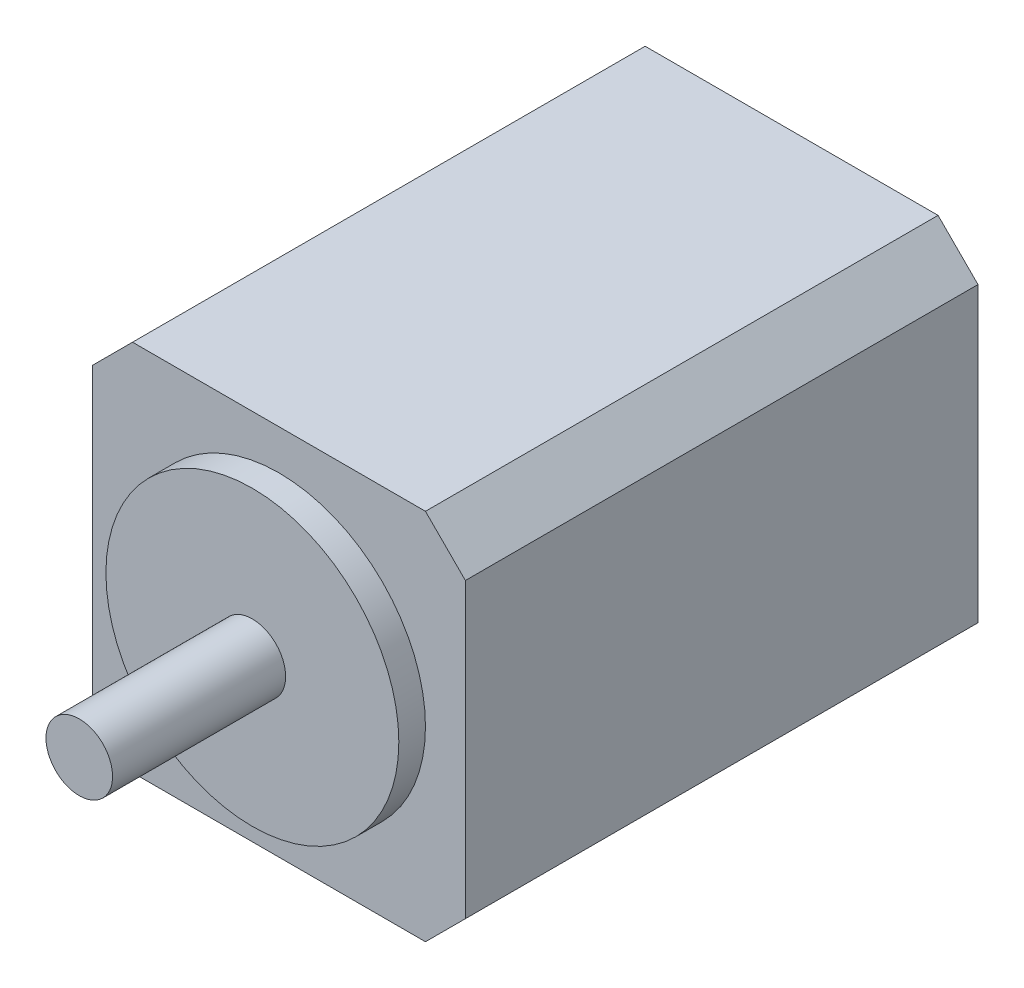
ISO-10303-21;
HEADER;
FILE_DESCRIPTION(('STEP AP214'),'2;1');
FILE_NAME('part.step','',(''),(''),'','','');
FILE_SCHEMA(('AUTOMOTIVE_DESIGN { 1 0 10303 214 1 1 1 1 }'));
ENDSEC;
DATA;
#1=APPLICATION_CONTEXT('core data for automotive mechanical design processes');
#2=APPLICATION_PROTOCOL_DEFINITION('international standard','automotive_design',2000,#1);
#3=PRODUCT_CONTEXT('',#1,'mechanical');
#4=PRODUCT('Part','Part','',(#3));
#5=PRODUCT_RELATED_PRODUCT_CATEGORY('part','',(#4));
#6=PRODUCT_DEFINITION_FORMATION('','',#4);
#7=PRODUCT_DEFINITION_CONTEXT('part definition',#1,'design');
#8=PRODUCT_DEFINITION('design','',#6,#7);
#9=PRODUCT_DEFINITION_SHAPE('','',#8);
#10=(LENGTH_UNIT() NAMED_UNIT(*) SI_UNIT(.MILLI.,.METRE.));
#11=(NAMED_UNIT(*) PLANE_ANGLE_UNIT() SI_UNIT($,.RADIAN.));
#12=(NAMED_UNIT(*) SI_UNIT($,.STERADIAN.) SOLID_ANGLE_UNIT());
#13=UNCERTAINTY_MEASURE_WITH_UNIT(LENGTH_MEASURE(1.E-05),#10,'distance_accuracy_value','');
#14=(GEOMETRIC_REPRESENTATION_CONTEXT(3) GLOBAL_UNCERTAINTY_ASSIGNED_CONTEXT((#13)) GLOBAL_UNIT_ASSIGNED_CONTEXT((#10,
#11,#12)) REPRESENTATION_CONTEXT('',''));
#15=CARTESIAN_POINT('',(0.,0.,0.));
#16=DIRECTION('',(0.,0.,1.));
#17=DIRECTION('',(1.,0.,0.));
#18=AXIS2_PLACEMENT_3D('',#15,#16,#17);
#19=CARTESIAN_POINT('',(14.,-14.,38.5));
#20=DIRECTION('',(-1.,0.,0.));
#21=DIRECTION('',(0.,0.,1.));
#22=AXIS2_PLACEMENT_3D('',#19,#20,#21);
#23=PLANE('',#22);
#24=DIRECTION('',(0.,1.,0.));
#25=VECTOR('',#24,1.);
#26=CARTESIAN_POINT('',(14.,-14.,38.5));
#27=LINE('',#26,#25);
#28=CARTESIAN_POINT('',(14.,-11.,38.5));
#29=VERTEX_POINT('',#28);
#30=CARTESIAN_POINT('',(14.,11.,38.5));
#31=VERTEX_POINT('',#30);
#32=EDGE_CURVE('E138',#29,#31,#27,.T.);
#33=ORIENTED_EDGE('',*,*,#32,.F.);
#34=DIRECTION('',(0.,0.,-1.));
#35=VECTOR('',#34,1.);
#36=CARTESIAN_POINT('',(14.,-11.,38.5));
#37=LINE('',#36,#35);
#38=CARTESIAN_POINT('',(14.,-11.,0.));
#39=VERTEX_POINT('',#38);
#40=EDGE_CURVE('E11',#29,#39,#37,.T.);
#41=ORIENTED_EDGE('',*,*,#40,.T.);
#42=DIRECTION('',(0.,1.,0.));
#43=VECTOR('',#42,1.);
#44=CARTESIAN_POINT('',(14.,-14.,0.));
#45=LINE('',#44,#43);
#46=CARTESIAN_POINT('',(14.,11.,0.));
#47=VERTEX_POINT('',#46);
#48=EDGE_CURVE('E170',#39,#47,#45,.T.);
#49=ORIENTED_EDGE('',*,*,#48,.T.);
#50=DIRECTION('',(0.,0.,1.));
#51=VECTOR('',#50,1.);
#52=CARTESIAN_POINT('',(14.,11.,38.5));
#53=LINE('',#52,#51);
#54=EDGE_CURVE('E52',#47,#31,#53,.T.);
#55=ORIENTED_EDGE('',*,*,#54,.T.);
#56=EDGE_LOOP('',(#33,#41,#49,#55));
#57=FACE_BOUND('',#56,.T.);
#58=ADVANCED_FACE('F43',(#57),#23,.F.);
#59=CARTESIAN_POINT('',(-14.,14.,38.5));
#60=DIRECTION('',(0.,-1.,0.));
#61=DIRECTION('',(0.,0.,-1.));
#62=AXIS2_PLACEMENT_3D('',#59,#60,#61);
#63=PLANE('',#62);
#64=DIRECTION('',(-1.,0.,0.));
#65=VECTOR('',#64,1.);
#66=CARTESIAN_POINT('',(-14.,14.,0.));
#67=LINE('',#66,#65);
#68=CARTESIAN_POINT('',(11.,14.,0.));
#69=VERTEX_POINT('',#68);
#70=CARTESIAN_POINT('',(-11.,14.,0.));
#71=VERTEX_POINT('',#70);
#72=EDGE_CURVE('E143',#69,#71,#67,.T.);
#73=ORIENTED_EDGE('',*,*,#72,.T.);
#74=DIRECTION('',(0.,0.,1.));
#75=VECTOR('',#74,1.);
#76=CARTESIAN_POINT('',(-11.,14.,38.5));
#77=LINE('',#76,#75);
#78=CARTESIAN_POINT('',(-11.,14.,38.5));
#79=VERTEX_POINT('',#78);
#80=EDGE_CURVE('E59',#71,#79,#77,.T.);
#81=ORIENTED_EDGE('',*,*,#80,.T.);
#82=DIRECTION('',(-1.,0.,0.));
#83=VECTOR('',#82,1.);
#84=CARTESIAN_POINT('',(-14.,14.,38.5));
#85=LINE('',#84,#83);
#86=CARTESIAN_POINT('',(11.,14.,38.5));
#87=VERTEX_POINT('',#86);
#88=EDGE_CURVE('E141',#87,#79,#85,.T.);
#89=ORIENTED_EDGE('',*,*,#88,.F.);
#90=DIRECTION('',(0.,0.,-1.));
#91=VECTOR('',#90,1.);
#92=CARTESIAN_POINT('',(11.,14.,38.5));
#93=LINE('',#92,#91);
#94=EDGE_CURVE('E162',#87,#69,#93,.T.);
#95=ORIENTED_EDGE('',*,*,#94,.T.);
#96=EDGE_LOOP('',(#73,#81,#89,#95));
#97=FACE_BOUND('',#96,.T.);
#98=ADVANCED_FACE('F177',(#97),#63,.F.);
#99=CARTESIAN_POINT('',(-14.,-14.,38.5));
#100=DIRECTION('',(1.,0.,0.));
#101=DIRECTION('',(0.,0.,-1.));
#102=AXIS2_PLACEMENT_3D('',#99,#100,#101);
#103=PLANE('',#102);
#104=DIRECTION('',(0.,-1.,0.));
#105=VECTOR('',#104,1.);
#106=CARTESIAN_POINT('',(-14.,-14.,0.));
#107=LINE('',#106,#105);
#108=CARTESIAN_POINT('',(-14.,11.,0.));
#109=VERTEX_POINT('',#108);
#110=CARTESIAN_POINT('',(-14.,-11.,0.));
#111=VERTEX_POINT('',#110);
#112=EDGE_CURVE('E139',#109,#111,#107,.T.);
#113=ORIENTED_EDGE('',*,*,#112,.T.);
#114=DIRECTION('',(0.,0.,1.));
#115=VECTOR('',#114,1.);
#116=CARTESIAN_POINT('',(-14.,-11.,38.5));
#117=LINE('',#116,#115);
#118=CARTESIAN_POINT('',(-14.,-11.,38.5));
#119=VERTEX_POINT('',#118);
#120=EDGE_CURVE('E116',#111,#119,#117,.T.);
#121=ORIENTED_EDGE('',*,*,#120,.T.);
#122=DIRECTION('',(0.,-1.,0.));
#123=VECTOR('',#122,1.);
#124=CARTESIAN_POINT('',(-14.,-14.,38.5));
#125=LINE('',#124,#123);
#126=CARTESIAN_POINT('',(-14.,11.,38.5));
#127=VERTEX_POINT('',#126);
#128=EDGE_CURVE('E183',#127,#119,#125,.T.);
#129=ORIENTED_EDGE('',*,*,#128,.F.);
#130=DIRECTION('',(0.,0.,-1.));
#131=VECTOR('',#130,1.);
#132=CARTESIAN_POINT('',(-14.,11.,38.5));
#133=LINE('',#132,#131);
#134=EDGE_CURVE('E121',#127,#109,#133,.T.);
#135=ORIENTED_EDGE('',*,*,#134,.T.);
#136=EDGE_LOOP('',(#113,#121,#129,#135));
#137=FACE_BOUND('',#136,.T.);
#138=ADVANCED_FACE('F223',(#137),#103,.F.);
#139=CARTESIAN_POINT('',(-14.,-14.,38.5));
#140=DIRECTION('',(0.,1.,0.));
#141=DIRECTION('',(0.,0.,1.));
#142=AXIS2_PLACEMENT_3D('',#139,#140,#141);
#143=PLANE('',#142);
#144=DIRECTION('',(1.,0.,0.));
#145=VECTOR('',#144,1.);
#146=CARTESIAN_POINT('',(-14.,-14.,38.5));
#147=LINE('',#146,#145);
#148=CARTESIAN_POINT('',(-11.,-14.,38.5));
#149=VERTEX_POINT('',#148);
#150=CARTESIAN_POINT('',(11.,-14.,38.5));
#151=VERTEX_POINT('',#150);
#152=EDGE_CURVE('E131',#149,#151,#147,.T.);
#153=ORIENTED_EDGE('',*,*,#152,.F.);
#154=DIRECTION('',(0.,0.,-1.));
#155=VECTOR('',#154,1.);
#156=CARTESIAN_POINT('',(-11.,-14.,38.5));
#157=LINE('',#156,#155);
#158=CARTESIAN_POINT('',(-11.,-14.,0.));
#159=VERTEX_POINT('',#158);
#160=EDGE_CURVE('E115',#149,#159,#157,.T.);
#161=ORIENTED_EDGE('',*,*,#160,.T.);
#162=DIRECTION('',(1.,0.,0.));
#163=VECTOR('',#162,1.);
#164=CARTESIAN_POINT('',(-14.,-14.,0.));
#165=LINE('',#164,#163);
#166=CARTESIAN_POINT('',(11.,-14.,0.));
#167=VERTEX_POINT('',#166);
#168=EDGE_CURVE('E128',#159,#167,#165,.T.);
#169=ORIENTED_EDGE('',*,*,#168,.T.);
#170=DIRECTION('',(0.,0.,1.));
#171=VECTOR('',#170,1.);
#172=CARTESIAN_POINT('',(11.,-14.,38.5));
#173=LINE('',#172,#171);
#174=EDGE_CURVE('E133',#167,#151,#173,.T.);
#175=ORIENTED_EDGE('',*,*,#174,.T.);
#176=EDGE_LOOP('',(#153,#161,#169,#175));
#177=FACE_BOUND('',#176,.T.);
#178=ADVANCED_FACE('F127',(#177),#143,.F.);
#179=CARTESIAN_POINT('',(0.,0.,38.5));
#180=DIRECTION('',(0.,0.,-1.));
#181=DIRECTION('',(-1.,0.,0.));
#182=AXIS2_PLACEMENT_3D('',#179,#180,#181);
#183=PLANE('',#182);
#184=CARTESIAN_POINT('',(0.,0.,38.5));
#185=DIRECTION('',(0.,0.,1.));
#186=DIRECTION('',(1.,0.,0.));
#187=AXIS2_PLACEMENT_3D('',#184,#185,#186);
#188=CIRCLE('',#187,11.);
#189=CARTESIAN_POINT('',(11.,0.,38.5));
#190=VERTEX_POINT('',#189);
#191=EDGE_CURVE('E182',#190,#190,#188,.T.);
#192=ORIENTED_EDGE('',*,*,#191,.F.);
#193=EDGE_LOOP('',(#192));
#194=FACE_BOUND('',#193,.T.);
#195=ORIENTED_EDGE('',*,*,#128,.T.);
#196=DIRECTION('',(-0.707106781186547,0.707106781186548,0.));
#197=VECTOR('',#196,1.);
#198=CARTESIAN_POINT('',(-11.,-14.,38.5));
#199=LINE('',#198,#197);
#200=EDGE_CURVE('E160',#119,#149,#199,.F.);
#201=ORIENTED_EDGE('',*,*,#200,.T.);
#202=ORIENTED_EDGE('',*,*,#152,.T.);
#203=DIRECTION('',(-0.707106781186548,-0.707106781186547,0.));
#204=VECTOR('',#203,1.);
#205=CARTESIAN_POINT('',(14.,-11.,38.5));
#206=LINE('',#205,#204);
#207=EDGE_CURVE('E156',#151,#29,#206,.F.);
#208=ORIENTED_EDGE('',*,*,#207,.T.);
#209=ORIENTED_EDGE('',*,*,#32,.T.);
#210=DIRECTION('',(0.707106781186547,-0.707106781186549,0.));
#211=VECTOR('',#210,1.);
#212=CARTESIAN_POINT('',(11.,14.,38.5));
#213=LINE('',#212,#211);
#214=EDGE_CURVE('E66',#31,#87,#213,.F.);
#215=ORIENTED_EDGE('',*,*,#214,.T.);
#216=ORIENTED_EDGE('',*,*,#88,.T.);
#217=DIRECTION('',(0.707106781186548,0.707106781186547,0.));
#218=VECTOR('',#217,1.);
#219=CARTESIAN_POINT('',(-14.,11.,38.5));
#220=LINE('',#219,#218);
#221=EDGE_CURVE('E158',#79,#127,#220,.F.);
#222=ORIENTED_EDGE('',*,*,#221,.T.);
#223=EDGE_LOOP('',(#195,#201,#202,#208,#209,#215,#216,#222));
#224=FACE_BOUND('',#223,.T.);
#225=ADVANCED_FACE('F173',(#194,#224),#183,.F.);
#226=CARTESIAN_POINT('',(0.,0.,0.));
#227=DIRECTION('',(0.,0.,-1.));
#228=DIRECTION('',(-1.,0.,0.));
#229=AXIS2_PLACEMENT_3D('',#226,#227,#228);
#230=PLANE('',#229);
#231=ORIENTED_EDGE('',*,*,#168,.F.);
#232=DIRECTION('',(0.707106781186547,-0.707106781186548,0.));
#233=VECTOR('',#232,1.);
#234=CARTESIAN_POINT('',(-12.5,-12.5,0.));
#235=LINE('',#234,#233);
#236=EDGE_CURVE('E111',#159,#111,#235,.F.);
#237=ORIENTED_EDGE('',*,*,#236,.T.);
#238=ORIENTED_EDGE('',*,*,#112,.F.);
#239=DIRECTION('',(-0.707106781186548,-0.707106781186547,0.));
#240=VECTOR('',#239,1.);
#241=CARTESIAN_POINT('',(-12.5,12.5,0.));
#242=LINE('',#241,#240);
#243=EDGE_CURVE('E122',#109,#71,#242,.F.);
#244=ORIENTED_EDGE('',*,*,#243,.T.);
#245=ORIENTED_EDGE('',*,*,#72,.F.);
#246=DIRECTION('',(-0.707106781186547,0.707106781186549,0.));
#247=VECTOR('',#246,1.);
#248=CARTESIAN_POINT('',(12.5,12.5,0.));
#249=LINE('',#248,#247);
#250=EDGE_CURVE('E132',#69,#47,#249,.F.);
#251=ORIENTED_EDGE('',*,*,#250,.T.);
#252=ORIENTED_EDGE('',*,*,#48,.F.);
#253=DIRECTION('',(0.707106781186548,0.707106781186547,0.));
#254=VECTOR('',#253,1.);
#255=CARTESIAN_POINT('',(12.5,-12.5,0.));
#256=LINE('',#255,#254);
#257=EDGE_CURVE('E137',#39,#167,#256,.F.);
#258=ORIENTED_EDGE('',*,*,#257,.T.);
#259=EDGE_LOOP('',(#231,#237,#238,#244,#245,#251,#252,#258));
#260=FACE_BOUND('',#259,.T.);
#261=ADVANCED_FACE('F135',(#260),#230,.T.);
#262=CARTESIAN_POINT('',(0.,0.,40.5));
#263=DIRECTION('',(0.,0.,-1.));
#264=DIRECTION('',(-1.,0.,0.));
#265=AXIS2_PLACEMENT_3D('',#262,#263,#264);
#266=CYLINDRICAL_SURFACE('',#265,11.);
#267=CARTESIAN_POINT('',(0.,0.,40.5));
#268=DIRECTION('',(0.,0.,1.));
#269=DIRECTION('',(1.,0.,0.));
#270=AXIS2_PLACEMENT_3D('',#267,#268,#269);
#271=CIRCLE('',#270,11.);
#272=CARTESIAN_POINT('',(11.,0.,40.5));
#273=VERTEX_POINT('',#272);
#274=EDGE_CURVE('E178',#273,#273,#271,.T.);
#275=ORIENTED_EDGE('',*,*,#274,.F.);
#276=EDGE_LOOP('',(#275));
#277=FACE_BOUND('',#276,.T.);
#278=ORIENTED_EDGE('',*,*,#191,.T.);
#279=EDGE_LOOP('',(#278));
#280=FACE_BOUND('',#279,.T.);
#281=ADVANCED_FACE('F207',(#277,#280),#266,.T.);
#282=CARTESIAN_POINT('',(0.,0.,40.5));
#283=DIRECTION('',(0.,0.,1.));
#284=DIRECTION('',(1.,0.,0.));
#285=AXIS2_PLACEMENT_3D('',#282,#283,#284);
#286=PLANE('',#285);
#287=CARTESIAN_POINT('',(0.,0.,40.5));
#288=DIRECTION('',(0.,0.,1.));
#289=DIRECTION('',(1.,0.,0.));
#290=AXIS2_PLACEMENT_3D('',#287,#288,#289);
#291=CIRCLE('',#290,2.5);
#292=CARTESIAN_POINT('',(-2.5,0.,40.5));
#293=VERTEX_POINT('',#292);
#294=EDGE_CURVE('E147',#293,#293,#291,.T.);
#295=ORIENTED_EDGE('',*,*,#294,.F.);
#296=EDGE_LOOP('',(#295));
#297=FACE_BOUND('',#296,.T.);
#298=ORIENTED_EDGE('',*,*,#274,.T.);
#299=EDGE_LOOP('',(#298));
#300=FACE_BOUND('',#299,.T.);
#301=ADVANCED_FACE('F201',(#297,#300),#286,.T.);
#302=CARTESIAN_POINT('',(0.,0.,53.5));
#303=DIRECTION('',(0.,0.,-1.));
#304=DIRECTION('',(-1.,0.,0.));
#305=AXIS2_PLACEMENT_3D('',#302,#303,#304);
#306=CYLINDRICAL_SURFACE('',#305,2.5);
#307=CARTESIAN_POINT('',(0.,0.,53.5));
#308=DIRECTION('',(0.,0.,1.));
#309=DIRECTION('',(1.,0.,0.));
#310=AXIS2_PLACEMENT_3D('',#307,#308,#309);
#311=CIRCLE('',#310,2.5);
#312=CARTESIAN_POINT('',(-2.5,0.,53.5));
#313=VERTEX_POINT('',#312);
#314=EDGE_CURVE('E190',#313,#313,#311,.T.);
#315=CARTESIAN_POINT('',(-2.5,0.,53.5));
#316=CARTESIAN_POINT('',(-2.5,0.,53.3645833333333));
#317=CARTESIAN_POINT('',(-2.5,0.,53.2291666666667));
#318=CARTESIAN_POINT('',(-2.5,0.,52.9583333333333));
#319=CARTESIAN_POINT('',(-2.5,0.,52.8229166666667));
#320=CARTESIAN_POINT('',(-2.5,0.,52.5520833333333));
#321=CARTESIAN_POINT('',(-2.5,0.,52.4166666666667));
#322=CARTESIAN_POINT('',(-2.5,0.,52.1458333333333));
#323=CARTESIAN_POINT('',(-2.5,0.,52.0104166666667));
#324=CARTESIAN_POINT('',(-2.5,0.,51.7395833333333));
#325=CARTESIAN_POINT('',(-2.5,0.,51.6041666666667));
#326=CARTESIAN_POINT('',(-2.5,0.,51.3333333333333));
#327=CARTESIAN_POINT('',(-2.5,0.,51.1979166666667));
#328=CARTESIAN_POINT('',(-2.5,0.,50.9270833333333));
#329=CARTESIAN_POINT('',(-2.5,0.,50.7916666666667));
#330=CARTESIAN_POINT('',(-2.5,0.,50.5208333333333));
#331=CARTESIAN_POINT('',(-2.5,0.,50.3854166666667));
#332=CARTESIAN_POINT('',(-2.5,0.,50.1145833333333));
#333=CARTESIAN_POINT('',(-2.5,0.,49.9791666666667));
#334=CARTESIAN_POINT('',(-2.5,0.,49.7083333333333));
#335=CARTESIAN_POINT('',(-2.5,0.,49.5729166666667));
#336=CARTESIAN_POINT('',(-2.5,0.,49.3020833333333));
#337=CARTESIAN_POINT('',(-2.5,0.,49.1666666666667));
#338=CARTESIAN_POINT('',(-2.5,0.,48.8958333333333));
#339=CARTESIAN_POINT('',(-2.5,0.,48.7604166666667));
#340=CARTESIAN_POINT('',(-2.5,0.,48.4895833333333));
#341=CARTESIAN_POINT('',(-2.5,0.,48.3541666666667));
#342=CARTESIAN_POINT('',(-2.5,0.,48.0833333333333));
#343=CARTESIAN_POINT('',(-2.5,0.,47.9479166666667));
#344=CARTESIAN_POINT('',(-2.5,0.,47.6770833333333));
#345=CARTESIAN_POINT('',(-2.5,0.,47.5416666666667));
#346=CARTESIAN_POINT('',(-2.5,0.,47.2708333333333));
#347=CARTESIAN_POINT('',(-2.5,0.,47.1354166666667));
#348=CARTESIAN_POINT('',(-2.5,0.,46.8645833333333));
#349=CARTESIAN_POINT('',(-2.5,0.,46.7291666666667));
#350=CARTESIAN_POINT('',(-2.5,0.,46.4583333333333));
#351=CARTESIAN_POINT('',(-2.5,0.,46.3229166666667));
#352=CARTESIAN_POINT('',(-2.5,0.,46.0520833333333));
#353=CARTESIAN_POINT('',(-2.5,0.,45.9166666666667));
#354=CARTESIAN_POINT('',(-2.5,0.,45.6458333333333));
#355=CARTESIAN_POINT('',(-2.5,0.,45.5104166666667));
#356=CARTESIAN_POINT('',(-2.5,0.,45.2395833333333));
#357=CARTESIAN_POINT('',(-2.5,0.,45.1041666666667));
#358=CARTESIAN_POINT('',(-2.5,0.,44.8333333333333));
#359=CARTESIAN_POINT('',(-2.5,0.,44.6979166666667));
#360=CARTESIAN_POINT('',(-2.5,0.,44.4270833333333));
#361=CARTESIAN_POINT('',(-2.5,0.,44.2916666666667));
#362=CARTESIAN_POINT('',(-2.5,0.,44.0208333333333));
#363=CARTESIAN_POINT('',(-2.5,0.,43.8854166666667));
#364=CARTESIAN_POINT('',(-2.5,0.,43.6145833333333));
#365=CARTESIAN_POINT('',(-2.5,0.,43.4791666666667));
#366=CARTESIAN_POINT('',(-2.5,0.,43.2083333333333));
#367=CARTESIAN_POINT('',(-2.5,0.,43.0729166666667));
#368=CARTESIAN_POINT('',(-2.5,0.,42.8020833333333));
#369=CARTESIAN_POINT('',(-2.5,0.,42.6666666666667));
#370=CARTESIAN_POINT('',(-2.5,0.,42.3958333333333));
#371=CARTESIAN_POINT('',(-2.5,0.,42.2604166666667));
#372=CARTESIAN_POINT('',(-2.5,0.,41.9895833333333));
#373=CARTESIAN_POINT('',(-2.5,0.,41.8541666666667));
#374=CARTESIAN_POINT('',(-2.5,0.,41.5833333333333));
#375=CARTESIAN_POINT('',(-2.5,0.,41.4479166666667));
#376=CARTESIAN_POINT('',(-2.5,0.,41.1770833333333));
#377=CARTESIAN_POINT('',(-2.5,0.,41.0416666666667));
#378=CARTESIAN_POINT('',(-2.5,0.,40.7708333333333));
#379=CARTESIAN_POINT('',(-2.5,0.,40.6354166666667));
#380=CARTESIAN_POINT('',(-2.5,0.,40.5));
#381=B_SPLINE_CURVE_WITH_KNOTS('',3,(#315,#316,#317,#318,#319,#320,#321,#322,#323,#324,#325,
#326,#327,#328,#329,#330,#331,#332,#333,#334,#335,#336,#337,#338,#339,#340,#341,#342,#343,#344,
#345,#346,#347,#348,#349,#350,#351,#352,#353,#354,#355,#356,#357,#358,#359,#360,#361,#362,#363,
#364,#365,#366,#367,#368,#369,#370,#371,#372,#373,#374,#375,#376,#377,#378,#379,#380),
.UNSPECIFIED.,.F.,.F.,(4,2,2,2,2,2,2,2,2,2,2,2,2,2,2,2,2,2,2,2,2,2,2,2,2,2,2,2,2,2,2,2,4),(0.,
0.406249999999997,0.812499999999994,1.21875,1.62499999999999,2.03125,2.4375,2.84374999999999,
3.25,3.65624999999999,4.0625,4.46874999999999,4.875,5.28124999999999,5.6875,6.09374999999999,
6.49999999999999,6.90625,7.31249999999999,7.71875,8.12499999999999,8.53124999999999,
8.93749999999999,9.34374999999999,9.74999999999999,10.15625,10.5625,10.96875,11.375,11.78125,
12.1875,12.59375,13.),.UNSPECIFIED.);
#382=EDGE_CURVE('BSEAM198',#313,#293,#381,.T.);
#383=ORIENTED_EDGE('',*,*,#314,.F.);
#384=ORIENTED_EDGE('',*,*,#294,.T.);
#385=ORIENTED_EDGE('',*,*,#382,.T.);
#386=ORIENTED_EDGE('',*,*,#382,.F.);
#387=EDGE_LOOP('',(#383,#385,#384,#386));
#388=FACE_BOUND('',#387,.T.);
#389=ADVANCED_FACE('F198',(#388),#306,.T.);
#390=CARTESIAN_POINT('',(0.,0.,53.5));
#391=DIRECTION('',(0.,0.,1.));
#392=DIRECTION('',(1.,0.,0.));
#393=AXIS2_PLACEMENT_3D('',#390,#391,#392);
#394=PLANE('',#393);
#395=ORIENTED_EDGE('',*,*,#314,.T.);
#396=EDGE_LOOP('',(#395));
#397=FACE_BOUND('',#396,.T.);
#398=ADVANCED_FACE('F196',(#397),#394,.T.);
#399=CARTESIAN_POINT('',(-11.,-14.,38.5));
#400=DIRECTION('',(0.707106781186548,0.707106781186547,0.));
#401=DIRECTION('',(0.,0.,-1.));
#402=AXIS2_PLACEMENT_3D('',#399,#400,#401);
#403=PLANE('',#402);
#404=ORIENTED_EDGE('',*,*,#200,.F.);
#405=ORIENTED_EDGE('',*,*,#120,.F.);
#406=ORIENTED_EDGE('',*,*,#236,.F.);
#407=ORIENTED_EDGE('',*,*,#160,.F.);
#408=EDGE_LOOP('',(#404,#405,#406,#407));
#409=FACE_BOUND('',#408,.T.);
#410=ADVANCED_FACE('F114',(#409),#403,.F.);
#411=CARTESIAN_POINT('',(-14.,11.,38.5));
#412=DIRECTION('',(0.707106781186547,-0.707106781186548,0.));
#413=DIRECTION('',(0.,0.,-1.));
#414=AXIS2_PLACEMENT_3D('',#411,#412,#413);
#415=PLANE('',#414);
#416=ORIENTED_EDGE('',*,*,#221,.F.);
#417=ORIENTED_EDGE('',*,*,#80,.F.);
#418=ORIENTED_EDGE('',*,*,#243,.F.);
#419=ORIENTED_EDGE('',*,*,#134,.F.);
#420=EDGE_LOOP('',(#416,#417,#418,#419));
#421=FACE_BOUND('',#420,.T.);
#422=ADVANCED_FACE('F240',(#421),#415,.F.);
#423=CARTESIAN_POINT('',(14.,-11.,38.5));
#424=DIRECTION('',(-0.707106781186547,0.707106781186548,0.));
#425=DIRECTION('',(0.,0.,-1.));
#426=AXIS2_PLACEMENT_3D('',#423,#424,#425);
#427=PLANE('',#426);
#428=ORIENTED_EDGE('',*,*,#207,.F.);
#429=ORIENTED_EDGE('',*,*,#174,.F.);
#430=ORIENTED_EDGE('',*,*,#257,.F.);
#431=ORIENTED_EDGE('',*,*,#40,.F.);
#432=EDGE_LOOP('',(#428,#429,#430,#431));
#433=FACE_BOUND('',#432,.T.);
#434=ADVANCED_FACE('F245',(#433),#427,.F.);
#435=CARTESIAN_POINT('',(11.,14.,38.5));
#436=DIRECTION('',(-0.707106781186549,-0.707106781186547,0.));
#437=DIRECTION('',(0.,0.,-1.));
#438=AXIS2_PLACEMENT_3D('',#435,#436,#437);
#439=PLANE('',#438);
#440=ORIENTED_EDGE('',*,*,#214,.F.);
#441=ORIENTED_EDGE('',*,*,#54,.F.);
#442=ORIENTED_EDGE('',*,*,#250,.F.);
#443=ORIENTED_EDGE('',*,*,#94,.F.);
#444=EDGE_LOOP('',(#440,#441,#442,#443));
#445=FACE_BOUND('',#444,.T.);
#446=ADVANCED_FACE('F46',(#445),#439,.F.);
#447=CLOSED_SHELL('',(#58,#98,#138,#178,#225,#261,#281,#301,#389,#398,#410,#422,#434,#446));
#448=MANIFOLD_SOLID_BREP('B2',#447);
#449=ADVANCED_BREP_SHAPE_REPRESENTATION('',(#18,#448),#14);
#450=SHAPE_DEFINITION_REPRESENTATION(#9,#449);
ENDSEC;
END-ISO-10303-21;
